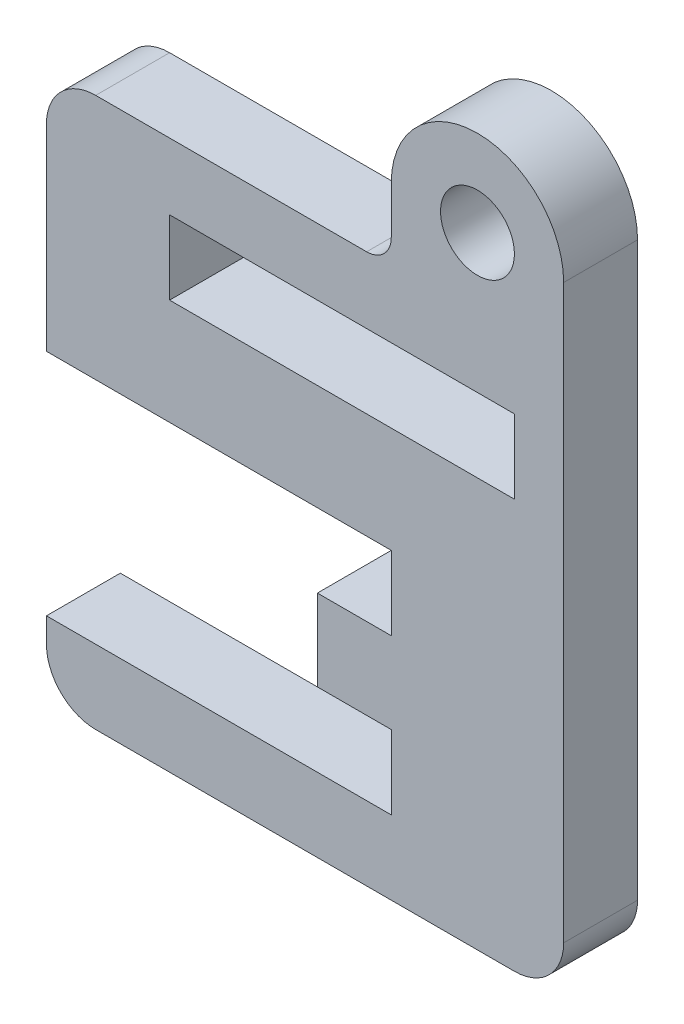
ISO-10303-21;
HEADER;
FILE_DESCRIPTION(('STEP AP214'),'2;1');
FILE_NAME('part.step','',(''),(''),'','','');
FILE_SCHEMA(('AUTOMOTIVE_DESIGN { 1 0 10303 214 1 1 1 1 }'));
ENDSEC;
DATA;
#1=APPLICATION_CONTEXT('core data for automotive mechanical design processes');
#2=APPLICATION_PROTOCOL_DEFINITION('international standard','automotive_design',2000,#1);
#3=PRODUCT_CONTEXT('',#1,'mechanical');
#4=PRODUCT('Part','Part','',(#3));
#5=PRODUCT_RELATED_PRODUCT_CATEGORY('part','',(#4));
#6=PRODUCT_DEFINITION_FORMATION('','',#4);
#7=PRODUCT_DEFINITION_CONTEXT('part definition',#1,'design');
#8=PRODUCT_DEFINITION('design','',#6,#7);
#9=PRODUCT_DEFINITION_SHAPE('','',#8);
#10=(LENGTH_UNIT() NAMED_UNIT(*) SI_UNIT(.MILLI.,.METRE.));
#11=(NAMED_UNIT(*) PLANE_ANGLE_UNIT() SI_UNIT($,.RADIAN.));
#12=(NAMED_UNIT(*) SI_UNIT($,.STERADIAN.) SOLID_ANGLE_UNIT());
#13=UNCERTAINTY_MEASURE_WITH_UNIT(LENGTH_MEASURE(1.E-05),#10,'distance_accuracy_value','');
#14=(GEOMETRIC_REPRESENTATION_CONTEXT(3) GLOBAL_UNCERTAINTY_ASSIGNED_CONTEXT((#13)) GLOBAL_UNIT_ASSIGNED_CONTEXT((#10,
#11,#12)) REPRESENTATION_CONTEXT('',''));
#15=CARTESIAN_POINT('',(0.,0.,0.));
#16=DIRECTION('',(0.,0.,1.));
#17=DIRECTION('',(1.,0.,0.));
#18=AXIS2_PLACEMENT_3D('',#15,#16,#17);
#19=CARTESIAN_POINT('',(-22.6037836217601,-2.1337939347687,3.));
#20=DIRECTION('',(1.,0.,0.));
#21=DIRECTION('',(0.,1.,0.));
#22=AXIS2_PLACEMENT_3D('',#19,#20,#21);
#23=PLANE('',#22);
#24=DIRECTION('',(0.,-1.,0.));
#25=VECTOR('',#24,1.);
#26=CARTESIAN_POINT('',(-22.6037836217601,-2.1337939347687,0.));
#27=LINE('',#26,#25);
#28=CARTESIAN_POINT('',(-22.6037836217601,16.1662060652313,0.));
#29=VERTEX_POINT('',#28);
#30=CARTESIAN_POINT('',(-22.6037836217601,8.1662060652313,0.));
#31=VERTEX_POINT('',#30);
#32=EDGE_CURVE('E273',#29,#31,#27,.T.);
#33=ORIENTED_EDGE('',*,*,#32,.T.);
#34=DIRECTION('',(0.,0.,1.));
#35=VECTOR('',#34,1.);
#36=CARTESIAN_POINT('',(-22.6037836217601,8.1662060652313,0.));
#37=LINE('',#36,#35);
#38=CARTESIAN_POINT('',(-22.6037836217601,8.1662060652313,3.));
#39=VERTEX_POINT('',#38);
#40=EDGE_CURVE('E432',#31,#39,#37,.T.);
#41=ORIENTED_EDGE('',*,*,#40,.T.);
#42=DIRECTION('',(0.,-1.,0.));
#43=VECTOR('',#42,1.);
#44=CARTESIAN_POINT('',(-22.6037836217601,-2.1337939347687,3.));
#45=LINE('',#44,#43);
#46=CARTESIAN_POINT('',(-22.6037836217601,16.1662060652313,3.));
#47=VERTEX_POINT('',#46);
#48=EDGE_CURVE('E238',#47,#39,#45,.T.);
#49=ORIENTED_EDGE('',*,*,#48,.F.);
#50=DIRECTION('',(0.,0.,-1.));
#51=VECTOR('',#50,1.);
#52=CARTESIAN_POINT('',(-22.6037836217601,16.1662060652313,3.));
#53=LINE('',#52,#51);
#54=EDGE_CURVE('E11',#47,#29,#53,.T.);
#55=ORIENTED_EDGE('',*,*,#54,.T.);
#56=EDGE_LOOP('',(#33,#41,#49,#55));
#57=FACE_BOUND('',#56,.T.);
#58=ADVANCED_FACE('F45',(#57),#23,.F.);
#59=CARTESIAN_POINT('',(-20.6037836217601,16.1662060652313,3.));
#60=DIRECTION('',(0.,0.,-1.));
#61=DIRECTION('',(-1.,0.,0.));
#62=AXIS2_PLACEMENT_3D('',#59,#60,#61);
#63=CYLINDRICAL_SURFACE('',#62,2.);
#64=CARTESIAN_POINT('',(-20.6037836217601,16.1662060652313,0.));
#65=DIRECTION('',(0.,0.,1.));
#66=DIRECTION('',(-1.,0.,0.));
#67=AXIS2_PLACEMENT_3D('',#64,#65,#66);
#68=CIRCLE('',#67,2.);
#69=CARTESIAN_POINT('',(-20.6037836217601,18.1662060652313,0.));
#70=VERTEX_POINT('',#69);
#71=EDGE_CURVE('E267',#70,#29,#68,.T.);
#72=ORIENTED_EDGE('',*,*,#71,.T.);
#73=ORIENTED_EDGE('',*,*,#54,.F.);
#74=CARTESIAN_POINT('',(-20.6037836217601,16.1662060652313,3.));
#75=DIRECTION('',(0.,0.,1.));
#76=DIRECTION('',(-1.,0.,0.));
#77=AXIS2_PLACEMENT_3D('',#74,#75,#76);
#78=CIRCLE('',#77,2.);
#79=CARTESIAN_POINT('',(-20.6037836217601,18.1662060652313,3.));
#80=VERTEX_POINT('',#79);
#81=EDGE_CURVE('E232',#80,#47,#78,.T.);
#82=ORIENTED_EDGE('',*,*,#81,.F.);
#83=DIRECTION('',(0.,0.,-1.));
#84=VECTOR('',#83,1.);
#85=CARTESIAN_POINT('',(-20.6037836217601,18.1662060652313,3.));
#86=LINE('',#85,#84);
#87=EDGE_CURVE('E266',#80,#70,#86,.T.);
#88=ORIENTED_EDGE('',*,*,#87,.T.);
#89=EDGE_LOOP('',(#72,#73,#82,#88));
#90=FACE_BOUND('',#89,.T.);
#91=ADVANCED_FACE('F47',(#90),#63,.T.);
#92=CARTESIAN_POINT('',(-22.6037836217601,-1.1337939347687,3.));
#93=VERTEX_POINT('',#92);
#94=CARTESIAN_POINT('',(-22.6037836217601,-2.1337939347687,3.));
#95=VERTEX_POINT('',#94);
#96=EDGE_CURVE('E236',#93,#95,#45,.T.);
#97=ORIENTED_EDGE('',*,*,#96,.F.);
#98=DIRECTION('',(0.,0.,1.));
#99=VECTOR('',#98,1.);
#100=CARTESIAN_POINT('',(-22.6037836217601,-1.1337939347687,0.));
#101=LINE('',#100,#99);
#102=CARTESIAN_POINT('',(-22.6037836217601,-1.1337939347687,0.));
#103=VERTEX_POINT('',#102);
#104=EDGE_CURVE('E218',#103,#93,#101,.T.);
#105=ORIENTED_EDGE('',*,*,#104,.F.);
#106=CARTESIAN_POINT('',(-22.6037836217601,-2.1337939347687,0.));
#107=VERTEX_POINT('',#106);
#108=EDGE_CURVE('E271',#103,#107,#27,.T.);
#109=ORIENTED_EDGE('',*,*,#108,.T.);
#110=DIRECTION('',(0.,0.,-1.));
#111=VECTOR('',#110,1.);
#112=CARTESIAN_POINT('',(-22.6037836217601,-2.1337939347687,3.));
#113=LINE('',#112,#111);
#114=EDGE_CURVE('E54',#95,#107,#113,.T.);
#115=ORIENTED_EDGE('',*,*,#114,.F.);
#116=EDGE_LOOP('',(#97,#105,#109,#115));
#117=FACE_BOUND('',#116,.T.);
#118=ADVANCED_FACE('F505',(#117),#23,.F.);
#119=CARTESIAN_POINT('',(-20.6037836217601,-2.1337939347687,3.));
#120=DIRECTION('',(0.,0.,-1.));
#121=DIRECTION('',(-1.,0.,0.));
#122=AXIS2_PLACEMENT_3D('',#119,#120,#121);
#123=CYLINDRICAL_SURFACE('',#122,2.);
#124=CARTESIAN_POINT('',(-20.6037836217601,-2.1337939347687,0.));
#125=DIRECTION('',(0.,0.,1.));
#126=DIRECTION('',(-1.,0.,0.));
#127=AXIS2_PLACEMENT_3D('',#124,#125,#126);
#128=CIRCLE('',#127,2.);
#129=CARTESIAN_POINT('',(-20.6037836217601,-4.1337939347687,0.));
#130=VERTEX_POINT('',#129);
#131=EDGE_CURVE('E277',#107,#130,#128,.T.);
#132=ORIENTED_EDGE('',*,*,#131,.T.);
#133=DIRECTION('',(0.,0.,-1.));
#134=VECTOR('',#133,1.);
#135=CARTESIAN_POINT('',(-20.6037836217601,-4.1337939347687,3.));
#136=LINE('',#135,#134);
#137=CARTESIAN_POINT('',(-20.6037836217601,-4.1337939347687,3.));
#138=VERTEX_POINT('',#137);
#139=EDGE_CURVE('E327',#138,#130,#136,.T.);
#140=ORIENTED_EDGE('',*,*,#139,.F.);
#141=CARTESIAN_POINT('',(-20.6037836217601,-2.1337939347687,3.));
#142=DIRECTION('',(0.,0.,1.));
#143=DIRECTION('',(-1.,0.,0.));
#144=AXIS2_PLACEMENT_3D('',#141,#142,#143);
#145=CIRCLE('',#144,2.);
#146=EDGE_CURVE('E242',#95,#138,#145,.T.);
#147=ORIENTED_EDGE('',*,*,#146,.F.);
#148=ORIENTED_EDGE('',*,*,#114,.T.);
#149=EDGE_LOOP('',(#132,#140,#147,#148));
#150=FACE_BOUND('',#149,.T.);
#151=ADVANCED_FACE('F336',(#150),#123,.T.);
#152=CARTESIAN_POINT('',(-3.60378362176012,-4.13379393476869,3.));
#153=DIRECTION('',(0.,1.,0.));
#154=DIRECTION('',(-1.,0.,0.));
#155=AXIS2_PLACEMENT_3D('',#152,#153,#154);
#156=PLANE('',#155);
#157=DIRECTION('',(1.,0.,0.));
#158=VECTOR('',#157,1.);
#159=CARTESIAN_POINT('',(-3.60378362176012,-4.13379393476869,0.));
#160=LINE('',#159,#158);
#161=CARTESIAN_POINT('',(-3.60378362176012,-4.13379393476869,0.));
#162=VERTEX_POINT('',#161);
#163=EDGE_CURVE('E280',#130,#162,#160,.T.);
#164=ORIENTED_EDGE('',*,*,#163,.T.);
#165=DIRECTION('',(0.,0.,-1.));
#166=VECTOR('',#165,1.);
#167=CARTESIAN_POINT('',(-3.60378362176012,-4.13379393476869,3.));
#168=LINE('',#167,#166);
#169=CARTESIAN_POINT('',(-3.60378362176012,-4.13379393476869,3.));
#170=VERTEX_POINT('',#169);
#171=EDGE_CURVE('E323',#170,#162,#168,.T.);
#172=ORIENTED_EDGE('',*,*,#171,.F.);
#173=DIRECTION('',(1.,0.,0.));
#174=VECTOR('',#173,1.);
#175=CARTESIAN_POINT('',(-3.60378362176012,-4.13379393476869,3.));
#176=LINE('',#175,#174);
#177=EDGE_CURVE('E245',#138,#170,#176,.T.);
#178=ORIENTED_EDGE('',*,*,#177,.F.);
#179=ORIENTED_EDGE('',*,*,#139,.T.);
#180=EDGE_LOOP('',(#164,#172,#178,#179));
#181=FACE_BOUND('',#180,.T.);
#182=ADVANCED_FACE('F346',(#181),#156,.F.);
#183=CARTESIAN_POINT('',(-3.60378362176012,-2.13379393476869,3.));
#184=DIRECTION('',(0.,0.,-1.));
#185=DIRECTION('',(-1.,0.,0.));
#186=AXIS2_PLACEMENT_3D('',#183,#184,#185);
#187=CYLINDRICAL_SURFACE('',#186,2.);
#188=CARTESIAN_POINT('',(-3.60378362176012,-2.13379393476869,0.));
#189=DIRECTION('',(0.,0.,1.));
#190=DIRECTION('',(-1.,0.,0.));
#191=AXIS2_PLACEMENT_3D('',#188,#189,#190);
#192=CIRCLE('',#191,2.);
#193=CARTESIAN_POINT('',(-1.60378362176012,-2.13379393476869,0.));
#194=VERTEX_POINT('',#193);
#195=EDGE_CURVE('E283',#162,#194,#192,.T.);
#196=ORIENTED_EDGE('',*,*,#195,.T.);
#197=DIRECTION('',(0.,0.,-1.));
#198=VECTOR('',#197,1.);
#199=CARTESIAN_POINT('',(-1.60378362176012,-2.13379393476869,3.));
#200=LINE('',#199,#198);
#201=CARTESIAN_POINT('',(-1.60378362176012,-2.13379393476869,3.));
#202=VERTEX_POINT('',#201);
#203=EDGE_CURVE('E319',#202,#194,#200,.T.);
#204=ORIENTED_EDGE('',*,*,#203,.F.);
#205=CARTESIAN_POINT('',(-3.60378362176012,-2.13379393476869,3.));
#206=DIRECTION('',(0.,0.,1.));
#207=DIRECTION('',(-1.,0.,0.));
#208=AXIS2_PLACEMENT_3D('',#205,#206,#207);
#209=CIRCLE('',#208,2.);
#210=EDGE_CURVE('E248',#170,#202,#209,.T.);
#211=ORIENTED_EDGE('',*,*,#210,.F.);
#212=ORIENTED_EDGE('',*,*,#171,.T.);
#213=EDGE_LOOP('',(#196,#204,#211,#212));
#214=FACE_BOUND('',#213,.T.);
#215=ADVANCED_FACE('F350',(#214),#187,.T.);
#216=CARTESIAN_POINT('',(-1.60378362176012,21.0862060652313,3.));
#217=DIRECTION('',(-1.,0.,0.));
#218=DIRECTION('',(0.,0.,1.));
#219=AXIS2_PLACEMENT_3D('',#216,#217,#218);
#220=PLANE('',#219);
#221=DIRECTION('',(0.,1.,0.));
#222=VECTOR('',#221,1.);
#223=CARTESIAN_POINT('',(-1.60378362176012,21.0862060652313,0.));
#224=LINE('',#223,#222);
#225=CARTESIAN_POINT('',(-1.60378362176012,21.0862060652313,0.));
#226=VERTEX_POINT('',#225);
#227=EDGE_CURVE('E286',#194,#226,#224,.T.);
#228=ORIENTED_EDGE('',*,*,#227,.T.);
#229=DIRECTION('',(0.,0.,-1.));
#230=VECTOR('',#229,1.);
#231=CARTESIAN_POINT('',(-1.60378362176012,21.0862060652313,3.));
#232=LINE('',#231,#230);
#233=CARTESIAN_POINT('',(-1.60378362176012,21.0862060652313,3.));
#234=VERTEX_POINT('',#233);
#235=EDGE_CURVE('E315',#234,#226,#232,.T.);
#236=ORIENTED_EDGE('',*,*,#235,.F.);
#237=DIRECTION('',(0.,1.,0.));
#238=VECTOR('',#237,1.);
#239=CARTESIAN_POINT('',(-1.60378362176012,21.0862060652313,3.));
#240=LINE('',#239,#238);
#241=EDGE_CURVE('E251',#202,#234,#240,.T.);
#242=ORIENTED_EDGE('',*,*,#241,.F.);
#243=ORIENTED_EDGE('',*,*,#203,.T.);
#244=EDGE_LOOP('',(#228,#236,#242,#243));
#245=FACE_BOUND('',#244,.T.);
#246=ADVANCED_FACE('F495',(#245),#220,.F.);
#247=CARTESIAN_POINT('',(-5.10378362176011,21.0862060652313,3.));
#248=DIRECTION('',(0.,0.,-1.));
#249=DIRECTION('',(-1.,0.,0.));
#250=AXIS2_PLACEMENT_3D('',#247,#248,#249);
#251=CYLINDRICAL_SURFACE('',#250,3.49999999999999);
#252=CARTESIAN_POINT('',(-5.10378362176011,21.0862060652313,0.));
#253=DIRECTION('',(0.,0.,1.));
#254=DIRECTION('',(-1.,0.,0.));
#255=AXIS2_PLACEMENT_3D('',#252,#253,#254);
#256=CIRCLE('',#255,3.49999999999999);
#257=CARTESIAN_POINT('',(-8.6037836217601,21.0862060652313,0.));
#258=VERTEX_POINT('',#257);
#259=EDGE_CURVE('E289',#226,#258,#256,.T.);
#260=ORIENTED_EDGE('',*,*,#259,.T.);
#261=DIRECTION('',(0.,0.,-1.));
#262=VECTOR('',#261,1.);
#263=CARTESIAN_POINT('',(-8.6037836217601,21.0862060652313,3.));
#264=LINE('',#263,#262);
#265=CARTESIAN_POINT('',(-8.6037836217601,21.0862060652313,3.));
#266=VERTEX_POINT('',#265);
#267=EDGE_CURVE('E311',#266,#258,#264,.T.);
#268=ORIENTED_EDGE('',*,*,#267,.F.);
#269=CARTESIAN_POINT('',(-5.10378362176011,21.0862060652313,3.));
#270=DIRECTION('',(0.,0.,1.));
#271=DIRECTION('',(-1.,0.,0.));
#272=AXIS2_PLACEMENT_3D('',#269,#270,#271);
#273=CIRCLE('',#272,3.49999999999999);
#274=EDGE_CURVE('E254',#234,#266,#273,.T.);
#275=ORIENTED_EDGE('',*,*,#274,.F.);
#276=ORIENTED_EDGE('',*,*,#235,.T.);
#277=EDGE_LOOP('',(#260,#268,#275,#276));
#278=FACE_BOUND('',#277,.T.);
#279=ADVANCED_FACE('F492',(#278),#251,.T.);
#280=CARTESIAN_POINT('',(-8.6037836217601,19.1662060652313,3.));
#281=DIRECTION('',(1.,0.,0.));
#282=DIRECTION('',(0.,0.,-1.));
#283=AXIS2_PLACEMENT_3D('',#280,#281,#282);
#284=PLANE('',#283);
#285=DIRECTION('',(0.,-1.,0.));
#286=VECTOR('',#285,1.);
#287=CARTESIAN_POINT('',(-8.6037836217601,19.1662060652313,0.));
#288=LINE('',#287,#286);
#289=CARTESIAN_POINT('',(-8.6037836217601,19.1662060652313,0.));
#290=VERTEX_POINT('',#289);
#291=EDGE_CURVE('E292',#258,#290,#288,.T.);
#292=ORIENTED_EDGE('',*,*,#291,.T.);
#293=DIRECTION('',(0.,0.,-1.));
#294=VECTOR('',#293,1.);
#295=CARTESIAN_POINT('',(-8.6037836217601,19.1662060652313,3.));
#296=LINE('',#295,#294);
#297=CARTESIAN_POINT('',(-8.6037836217601,19.1662060652313,3.));
#298=VERTEX_POINT('',#297);
#299=EDGE_CURVE('E307',#298,#290,#296,.T.);
#300=ORIENTED_EDGE('',*,*,#299,.F.);
#301=DIRECTION('',(0.,-1.,0.));
#302=VECTOR('',#301,1.);
#303=CARTESIAN_POINT('',(-8.6037836217601,19.1662060652313,3.));
#304=LINE('',#303,#302);
#305=EDGE_CURVE('E257',#266,#298,#304,.T.);
#306=ORIENTED_EDGE('',*,*,#305,.F.);
#307=ORIENTED_EDGE('',*,*,#267,.T.);
#308=EDGE_LOOP('',(#292,#300,#306,#307));
#309=FACE_BOUND('',#308,.T.);
#310=ADVANCED_FACE('F488',(#309),#284,.F.);
#311=CARTESIAN_POINT('',(-9.6037836217601,19.1662060652313,3.));
#312=DIRECTION('',(0.,0.,-1.));
#313=DIRECTION('',(-1.,0.,0.));
#314=AXIS2_PLACEMENT_3D('',#311,#312,#313);
#315=CYLINDRICAL_SURFACE('',#314,1.);
#316=CARTESIAN_POINT('',(-9.6037836217601,19.1662060652313,0.));
#317=DIRECTION('',(0.,0.,-1.));
#318=DIRECTION('',(1.,0.,0.));
#319=AXIS2_PLACEMENT_3D('',#316,#317,#318);
#320=CIRCLE('',#319,1.);
#321=CARTESIAN_POINT('',(-9.6037836217601,18.1662060652313,0.));
#322=VERTEX_POINT('',#321);
#323=EDGE_CURVE('E295',#290,#322,#320,.T.);
#324=ORIENTED_EDGE('',*,*,#323,.T.);
#325=DIRECTION('',(0.,0.,-1.));
#326=VECTOR('',#325,1.);
#327=CARTESIAN_POINT('',(-9.6037836217601,18.1662060652313,3.));
#328=LINE('',#327,#326);
#329=CARTESIAN_POINT('',(-9.6037836217601,18.1662060652313,3.));
#330=VERTEX_POINT('',#329);
#331=EDGE_CURVE('E303',#330,#322,#328,.T.);
#332=ORIENTED_EDGE('',*,*,#331,.F.);
#333=CARTESIAN_POINT('',(-9.6037836217601,19.1662060652313,3.));
#334=DIRECTION('',(0.,0.,-1.));
#335=DIRECTION('',(1.,0.,0.));
#336=AXIS2_PLACEMENT_3D('',#333,#334,#335);
#337=CIRCLE('',#336,1.);
#338=EDGE_CURVE('E260',#298,#330,#337,.T.);
#339=ORIENTED_EDGE('',*,*,#338,.F.);
#340=ORIENTED_EDGE('',*,*,#299,.T.);
#341=EDGE_LOOP('',(#324,#332,#339,#340));
#342=FACE_BOUND('',#341,.T.);
#343=ADVANCED_FACE('F484',(#342),#315,.F.);
#344=CARTESIAN_POINT('',(-20.6037836217601,18.1662060652313,3.));
#345=DIRECTION('',(0.,-1.,0.));
#346=DIRECTION('',(0.,0.,-1.));
#347=AXIS2_PLACEMENT_3D('',#344,#345,#346);
#348=PLANE('',#347);
#349=DIRECTION('',(-1.,0.,0.));
#350=VECTOR('',#349,1.);
#351=CARTESIAN_POINT('',(-20.6037836217601,18.1662060652313,0.));
#352=LINE('',#351,#350);
#353=EDGE_CURVE('E237',#322,#70,#352,.T.);
#354=ORIENTED_EDGE('',*,*,#353,.T.);
#355=ORIENTED_EDGE('',*,*,#87,.F.);
#356=DIRECTION('',(-1.,0.,0.));
#357=VECTOR('',#356,1.);
#358=CARTESIAN_POINT('',(-20.6037836217601,18.1662060652313,3.));
#359=LINE('',#358,#357);
#360=EDGE_CURVE('E263',#330,#80,#359,.T.);
#361=ORIENTED_EDGE('',*,*,#360,.F.);
#362=ORIENTED_EDGE('',*,*,#331,.T.);
#363=EDGE_LOOP('',(#354,#355,#361,#362));
#364=FACE_BOUND('',#363,.T.);
#365=ADVANCED_FACE('F479',(#364),#348,.F.);
#366=CARTESIAN_POINT('',(-20.6037836217601,16.1662060652313,3.));
#367=DIRECTION('',(0.,0.,-1.));
#368=DIRECTION('',(-1.,0.,0.));
#369=AXIS2_PLACEMENT_3D('',#366,#367,#368);
#370=PLANE('',#369);
#371=CARTESIAN_POINT('',(-5.10378362176011,21.0862060652313,3.));
#372=DIRECTION('',(0.,0.,1.));
#373=DIRECTION('',(1.,0.,0.));
#374=AXIS2_PLACEMENT_3D('',#371,#372,#373);
#375=CIRCLE('',#374,1.5);
#376=CARTESIAN_POINT('',(-3.60378362176011,21.0862060652313,3.));
#377=VERTEX_POINT('',#376);
#378=EDGE_CURVE('E449',#377,#377,#375,.T.);
#379=ORIENTED_EDGE('',*,*,#378,.F.);
#380=EDGE_LOOP('',(#379));
#381=FACE_BOUND('',#380,.T.);
#382=DIRECTION('',(1.,0.,0.));
#383=VECTOR('',#382,1.);
#384=CARTESIAN_POINT('',(-17.6037836217601,12.4662060652313,3.));
#385=LINE('',#384,#383);
#386=CARTESIAN_POINT('',(-17.6037836217601,12.4662060652313,3.));
#387=VERTEX_POINT('',#386);
#388=CARTESIAN_POINT('',(-3.60378362176012,12.4662060652313,3.));
#389=VERTEX_POINT('',#388);
#390=EDGE_CURVE('E398',#387,#389,#385,.T.);
#391=ORIENTED_EDGE('',*,*,#390,.F.);
#392=DIRECTION('',(0.,-1.,0.));
#393=VECTOR('',#392,1.);
#394=CARTESIAN_POINT('',(-17.6037836217601,15.4662060652313,3.));
#395=LINE('',#394,#393);
#396=CARTESIAN_POINT('',(-17.6037836217601,15.4662060652313,3.));
#397=VERTEX_POINT('',#396);
#398=EDGE_CURVE('E69',#397,#387,#395,.T.);
#399=ORIENTED_EDGE('',*,*,#398,.F.);
#400=DIRECTION('',(-1.,0.,0.));
#401=VECTOR('',#400,1.);
#402=CARTESIAN_POINT('',(-17.6037836217601,15.4662060652313,3.));
#403=LINE('',#402,#401);
#404=CARTESIAN_POINT('',(-3.60378362176012,15.4662060652313,3.));
#405=VERTEX_POINT('',#404);
#406=EDGE_CURVE('E390',#405,#397,#403,.T.);
#407=ORIENTED_EDGE('',*,*,#406,.F.);
#408=DIRECTION('',(0.,1.,0.));
#409=VECTOR('',#408,1.);
#410=CARTESIAN_POINT('',(-3.60378362176012,15.4662060652313,3.));
#411=LINE('',#410,#409);
#412=EDGE_CURVE('E394',#389,#405,#411,.T.);
#413=ORIENTED_EDGE('',*,*,#412,.F.);
#414=EDGE_LOOP('',(#391,#399,#407,#413));
#415=FACE_BOUND('',#414,.T.);
#416=DIRECTION('',(1.,0.,0.));
#417=VECTOR('',#416,1.);
#418=CARTESIAN_POINT('',(-22.6037836217601,5.1662060652313,3.));
#419=LINE('',#418,#417);
#420=CARTESIAN_POINT('',(-11.6037836217601,5.1662060652313,3.));
#421=VERTEX_POINT('',#420);
#422=CARTESIAN_POINT('',(-8.60378362176012,5.1662060652313,3.));
#423=VERTEX_POINT('',#422);
#424=EDGE_CURVE('E404',#421,#423,#419,.T.);
#425=ORIENTED_EDGE('',*,*,#424,.F.);
#426=DIRECTION('',(0.,1.,0.));
#427=VECTOR('',#426,1.);
#428=CARTESIAN_POINT('',(-11.6037836217601,5.1662060652313,3.));
#429=LINE('',#428,#427);
#430=CARTESIAN_POINT('',(-11.6037836217601,1.8662060652313,3.));
#431=VERTEX_POINT('',#430);
#432=EDGE_CURVE('E61',#431,#421,#429,.T.);
#433=ORIENTED_EDGE('',*,*,#432,.F.);
#434=DIRECTION('',(-1.,0.,0.));
#435=VECTOR('',#434,1.);
#436=CARTESIAN_POINT('',(-22.6037836217601,1.8662060652313,3.));
#437=LINE('',#436,#435);
#438=CARTESIAN_POINT('',(-8.60378362176012,1.8662060652313,3.));
#439=VERTEX_POINT('',#438);
#440=EDGE_CURVE('E210',#439,#431,#437,.T.);
#441=ORIENTED_EDGE('',*,*,#440,.F.);
#442=DIRECTION('',(0.,1.,0.));
#443=VECTOR('',#442,1.);
#444=CARTESIAN_POINT('',(-8.60378362176012,1.8662060652313,3.));
#445=LINE('',#444,#443);
#446=CARTESIAN_POINT('',(-8.60378362176012,-1.1337939347687,3.));
#447=VERTEX_POINT('',#446);
#448=EDGE_CURVE('E438',#447,#439,#445,.T.);
#449=ORIENTED_EDGE('',*,*,#448,.F.);
#450=DIRECTION('',(1.,0.,0.));
#451=VECTOR('',#450,1.);
#452=CARTESIAN_POINT('',(-22.6037836217601,-1.1337939347687,3.));
#453=LINE('',#452,#451);
#454=EDGE_CURVE('E227',#93,#447,#453,.T.);
#455=ORIENTED_EDGE('',*,*,#454,.F.);
#456=ORIENTED_EDGE('',*,*,#96,.T.);
#457=ORIENTED_EDGE('',*,*,#146,.T.);
#458=ORIENTED_EDGE('',*,*,#177,.T.);
#459=ORIENTED_EDGE('',*,*,#210,.T.);
#460=ORIENTED_EDGE('',*,*,#241,.T.);
#461=ORIENTED_EDGE('',*,*,#274,.T.);
#462=ORIENTED_EDGE('',*,*,#305,.T.);
#463=ORIENTED_EDGE('',*,*,#338,.T.);
#464=ORIENTED_EDGE('',*,*,#360,.T.);
#465=ORIENTED_EDGE('',*,*,#81,.T.);
#466=ORIENTED_EDGE('',*,*,#48,.T.);
#467=DIRECTION('',(-1.,0.,0.));
#468=VECTOR('',#467,1.);
#469=CARTESIAN_POINT('',(-22.6037836217601,8.1662060652313,3.));
#470=LINE('',#469,#468);
#471=CARTESIAN_POINT('',(-8.60378362176012,8.1662060652313,3.));
#472=VERTEX_POINT('',#471);
#473=EDGE_CURVE('E411',#472,#39,#470,.T.);
#474=ORIENTED_EDGE('',*,*,#473,.F.);
#475=DIRECTION('',(0.,1.,0.));
#476=VECTOR('',#475,1.);
#477=CARTESIAN_POINT('',(-8.60378362176012,8.1662060652313,3.));
#478=LINE('',#477,#476);
#479=EDGE_CURVE('E407',#423,#472,#478,.T.);
#480=ORIENTED_EDGE('',*,*,#479,.F.);
#481=EDGE_LOOP('',(#425,#433,#441,#449,#455,#456,#457,#458,#459,#460,#461,#462,#463,#464,#465,
#466,#474,#480));
#482=FACE_BOUND('',#481,.T.);
#483=ADVANCED_FACE('F355',(#381,#415,#482),#370,.F.);
#484=CARTESIAN_POINT('',(-20.6037836217601,16.1662060652313,0.));
#485=DIRECTION('',(0.,0.,-1.));
#486=DIRECTION('',(-1.,0.,0.));
#487=AXIS2_PLACEMENT_3D('',#484,#485,#486);
#488=PLANE('',#487);
#489=DIRECTION('',(0.,1.,0.));
#490=VECTOR('',#489,1.);
#491=CARTESIAN_POINT('',(-11.6037836217601,5.1662060652313,0.));
#492=LINE('',#491,#490);
#493=CARTESIAN_POINT('',(-11.6037836217601,1.8662060652313,0.));
#494=VERTEX_POINT('',#493);
#495=CARTESIAN_POINT('',(-11.6037836217601,5.1662060652313,0.));
#496=VERTEX_POINT('',#495);
#497=EDGE_CURVE('E193',#494,#496,#492,.T.);
#498=ORIENTED_EDGE('',*,*,#497,.T.);
#499=DIRECTION('',(1.,0.,0.));
#500=VECTOR('',#499,1.);
#501=CARTESIAN_POINT('',(-22.6037836217601,5.1662060652313,0.));
#502=LINE('',#501,#500);
#503=CARTESIAN_POINT('',(-8.60378362176012,5.1662060652313,0.));
#504=VERTEX_POINT('',#503);
#505=EDGE_CURVE('E414',#496,#504,#502,.T.);
#506=ORIENTED_EDGE('',*,*,#505,.T.);
#507=DIRECTION('',(0.,1.,0.));
#508=VECTOR('',#507,1.);
#509=CARTESIAN_POINT('',(-8.60378362176012,8.1662060652313,0.));
#510=LINE('',#509,#508);
#511=CARTESIAN_POINT('',(-8.60378362176012,8.1662060652313,0.));
#512=VERTEX_POINT('',#511);
#513=EDGE_CURVE('E417',#504,#512,#510,.T.);
#514=ORIENTED_EDGE('',*,*,#513,.T.);
#515=DIRECTION('',(-1.,0.,0.));
#516=VECTOR('',#515,1.);
#517=CARTESIAN_POINT('',(-22.6037836217601,8.1662060652313,0.));
#518=LINE('',#517,#516);
#519=EDGE_CURVE('E421',#512,#31,#518,.T.);
#520=ORIENTED_EDGE('',*,*,#519,.T.);
#521=ORIENTED_EDGE('',*,*,#32,.F.);
#522=ORIENTED_EDGE('',*,*,#71,.F.);
#523=ORIENTED_EDGE('',*,*,#353,.F.);
#524=ORIENTED_EDGE('',*,*,#323,.F.);
#525=ORIENTED_EDGE('',*,*,#291,.F.);
#526=ORIENTED_EDGE('',*,*,#259,.F.);
#527=ORIENTED_EDGE('',*,*,#227,.F.);
#528=ORIENTED_EDGE('',*,*,#195,.F.);
#529=ORIENTED_EDGE('',*,*,#163,.F.);
#530=ORIENTED_EDGE('',*,*,#131,.F.);
#531=ORIENTED_EDGE('',*,*,#108,.F.);
#532=DIRECTION('',(1.,0.,0.));
#533=VECTOR('',#532,1.);
#534=CARTESIAN_POINT('',(-22.6037836217601,-1.1337939347687,0.));
#535=LINE('',#534,#533);
#536=CARTESIAN_POINT('',(-8.60378362176012,-1.1337939347687,0.));
#537=VERTEX_POINT('',#536);
#538=EDGE_CURVE('E222',#103,#537,#535,.T.);
#539=ORIENTED_EDGE('',*,*,#538,.T.);
#540=DIRECTION('',(0.,1.,0.));
#541=VECTOR('',#540,1.);
#542=CARTESIAN_POINT('',(-8.60378362176012,1.8662060652313,0.));
#543=LINE('',#542,#541);
#544=CARTESIAN_POINT('',(-8.60378362176012,1.8662060652313,0.));
#545=VERTEX_POINT('',#544);
#546=EDGE_CURVE('E216',#537,#545,#543,.T.);
#547=ORIENTED_EDGE('',*,*,#546,.T.);
#548=DIRECTION('',(-1.,0.,0.));
#549=VECTOR('',#548,1.);
#550=CARTESIAN_POINT('',(-22.6037836217601,1.8662060652313,0.));
#551=LINE('',#550,#549);
#552=EDGE_CURVE('E207',#545,#494,#551,.T.);
#553=ORIENTED_EDGE('',*,*,#552,.T.);
#554=EDGE_LOOP('',(#498,#506,#514,#520,#521,#522,#523,#524,#525,#526,#527,#528,#529,#530,#531,
#539,#547,#553));
#555=FACE_BOUND('',#554,.T.);
#556=CARTESIAN_POINT('',(-5.10378362176011,21.0862060652313,0.));
#557=DIRECTION('',(0.,0.,1.));
#558=DIRECTION('',(1.,0.,0.));
#559=AXIS2_PLACEMENT_3D('',#556,#557,#558);
#560=CIRCLE('',#559,1.5);
#561=CARTESIAN_POINT('',(-3.60378362176011,21.0862060652313,0.));
#562=VERTEX_POINT('',#561);
#563=EDGE_CURVE('E446',#562,#562,#560,.T.);
#564=ORIENTED_EDGE('',*,*,#563,.T.);
#565=EDGE_LOOP('',(#564));
#566=FACE_BOUND('',#565,.T.);
#567=DIRECTION('',(0.,-1.,0.));
#568=VECTOR('',#567,1.);
#569=CARTESIAN_POINT('',(-17.6037836217601,15.4662060652313,0.));
#570=LINE('',#569,#568);
#571=CARTESIAN_POINT('',(-17.6037836217601,15.4662060652313,0.));
#572=VERTEX_POINT('',#571);
#573=CARTESIAN_POINT('',(-17.6037836217601,12.4662060652313,0.));
#574=VERTEX_POINT('',#573);
#575=EDGE_CURVE('E386',#572,#574,#570,.T.);
#576=ORIENTED_EDGE('',*,*,#575,.T.);
#577=DIRECTION('',(1.,0.,0.));
#578=VECTOR('',#577,1.);
#579=CARTESIAN_POINT('',(-17.6037836217601,12.4662060652313,0.));
#580=LINE('',#579,#578);
#581=CARTESIAN_POINT('',(-3.60378362176012,12.4662060652313,0.));
#582=VERTEX_POINT('',#581);
#583=EDGE_CURVE('E382',#574,#582,#580,.T.);
#584=ORIENTED_EDGE('',*,*,#583,.T.);
#585=DIRECTION('',(0.,1.,0.));
#586=VECTOR('',#585,1.);
#587=CARTESIAN_POINT('',(-3.60378362176012,15.4662060652313,0.));
#588=LINE('',#587,#586);
#589=CARTESIAN_POINT('',(-3.60378362176012,15.4662060652313,0.));
#590=VERTEX_POINT('',#589);
#591=EDGE_CURVE('E378',#582,#590,#588,.T.);
#592=ORIENTED_EDGE('',*,*,#591,.T.);
#593=DIRECTION('',(-1.,0.,0.));
#594=VECTOR('',#593,1.);
#595=CARTESIAN_POINT('',(-17.6037836217601,15.4662060652313,0.));
#596=LINE('',#595,#594);
#597=EDGE_CURVE('E374',#590,#572,#596,.T.);
#598=ORIENTED_EDGE('',*,*,#597,.T.);
#599=EDGE_LOOP('',(#576,#584,#592,#598));
#600=FACE_BOUND('',#599,.T.);
#601=ADVANCED_FACE('F213',(#555,#566,#600),#488,.T.);
#602=CARTESIAN_POINT('',(-22.6037836217601,1.8662060652313,0.));
#603=DIRECTION('',(0.,1.,0.));
#604=DIRECTION('',(-1.,0.,0.));
#605=AXIS2_PLACEMENT_3D('',#602,#603,#604);
#606=PLANE('',#605);
#607=ORIENTED_EDGE('',*,*,#440,.T.);
#608=DIRECTION('',(0.,0.,1.));
#609=VECTOR('',#608,1.);
#610=CARTESIAN_POINT('',(-11.6037836217601,1.8662060652313,0.));
#611=LINE('',#610,#609);
#612=EDGE_CURVE('E196',#494,#431,#611,.T.);
#613=ORIENTED_EDGE('',*,*,#612,.F.);
#614=ORIENTED_EDGE('',*,*,#552,.F.);
#615=DIRECTION('',(0.,0.,1.));
#616=VECTOR('',#615,1.);
#617=CARTESIAN_POINT('',(-8.60378362176012,1.8662060652313,0.));
#618=LINE('',#617,#616);
#619=EDGE_CURVE('E443',#545,#439,#618,.T.);
#620=ORIENTED_EDGE('',*,*,#619,.T.);
#621=EDGE_LOOP('',(#607,#613,#614,#620));
#622=FACE_BOUND('',#621,.T.);
#623=ADVANCED_FACE('F206',(#622),#606,.F.);
#624=CARTESIAN_POINT('',(-8.60378362176012,1.8662060652313,0.));
#625=DIRECTION('',(1.,0.,0.));
#626=DIRECTION('',(0.,0.,-1.));
#627=AXIS2_PLACEMENT_3D('',#624,#625,#626);
#628=PLANE('',#627);
#629=ORIENTED_EDGE('',*,*,#448,.T.);
#630=ORIENTED_EDGE('',*,*,#619,.F.);
#631=ORIENTED_EDGE('',*,*,#546,.F.);
#632=DIRECTION('',(0.,0.,1.));
#633=VECTOR('',#632,1.);
#634=CARTESIAN_POINT('',(-8.60378362176012,-1.1337939347687,0.));
#635=LINE('',#634,#633);
#636=EDGE_CURVE('E224',#537,#447,#635,.T.);
#637=ORIENTED_EDGE('',*,*,#636,.T.);
#638=EDGE_LOOP('',(#629,#630,#631,#637));
#639=FACE_BOUND('',#638,.T.);
#640=ADVANCED_FACE('F592',(#639),#628,.F.);
#641=CARTESIAN_POINT('',(-22.6037836217601,-1.1337939347687,0.));
#642=DIRECTION('',(0.,-1.,0.));
#643=DIRECTION('',(1.,0.,0.));
#644=AXIS2_PLACEMENT_3D('',#641,#642,#643);
#645=PLANE('',#644);
#646=ORIENTED_EDGE('',*,*,#454,.T.);
#647=ORIENTED_EDGE('',*,*,#636,.F.);
#648=ORIENTED_EDGE('',*,*,#538,.F.);
#649=ORIENTED_EDGE('',*,*,#104,.T.);
#650=EDGE_LOOP('',(#646,#647,#648,#649));
#651=FACE_BOUND('',#650,.T.);
#652=ADVANCED_FACE('F601',(#651),#645,.F.);
#653=CARTESIAN_POINT('',(-22.6037836217601,8.1662060652313,0.));
#654=DIRECTION('',(0.,1.,0.));
#655=DIRECTION('',(-1.,0.,0.));
#656=AXIS2_PLACEMENT_3D('',#653,#654,#655);
#657=PLANE('',#656);
#658=ORIENTED_EDGE('',*,*,#473,.T.);
#659=ORIENTED_EDGE('',*,*,#40,.F.);
#660=ORIENTED_EDGE('',*,*,#519,.F.);
#661=DIRECTION('',(0.,0.,1.));
#662=VECTOR('',#661,1.);
#663=CARTESIAN_POINT('',(-8.60378362176012,8.1662060652313,0.));
#664=LINE('',#663,#662);
#665=EDGE_CURVE('E429',#512,#472,#664,.T.);
#666=ORIENTED_EDGE('',*,*,#665,.T.);
#667=EDGE_LOOP('',(#658,#659,#660,#666));
#668=FACE_BOUND('',#667,.T.);
#669=ADVANCED_FACE('F611',(#668),#657,.F.);
#670=CARTESIAN_POINT('',(-8.60378362176012,8.1662060652313,0.));
#671=DIRECTION('',(1.,0.,0.));
#672=DIRECTION('',(0.,1.,0.));
#673=AXIS2_PLACEMENT_3D('',#670,#671,#672);
#674=PLANE('',#673);
#675=ORIENTED_EDGE('',*,*,#479,.T.);
#676=ORIENTED_EDGE('',*,*,#665,.F.);
#677=ORIENTED_EDGE('',*,*,#513,.F.);
#678=DIRECTION('',(0.,0.,1.));
#679=VECTOR('',#678,1.);
#680=CARTESIAN_POINT('',(-8.60378362176012,5.1662060652313,0.));
#681=LINE('',#680,#679);
#682=EDGE_CURVE('E425',#504,#423,#681,.T.);
#683=ORIENTED_EDGE('',*,*,#682,.T.);
#684=EDGE_LOOP('',(#675,#676,#677,#683));
#685=FACE_BOUND('',#684,.T.);
#686=ADVANCED_FACE('F465',(#685),#674,.F.);
#687=CARTESIAN_POINT('',(-22.6037836217601,5.1662060652313,0.));
#688=DIRECTION('',(0.,-1.,0.));
#689=DIRECTION('',(1.,0.,0.));
#690=AXIS2_PLACEMENT_3D('',#687,#688,#689);
#691=PLANE('',#690);
#692=ORIENTED_EDGE('',*,*,#505,.F.);
#693=DIRECTION('',(0.,0.,1.));
#694=VECTOR('',#693,1.);
#695=CARTESIAN_POINT('',(-11.6037836217601,5.1662060652313,0.));
#696=LINE('',#695,#694);
#697=EDGE_CURVE('E197',#496,#421,#696,.T.);
#698=ORIENTED_EDGE('',*,*,#697,.T.);
#699=ORIENTED_EDGE('',*,*,#424,.T.);
#700=ORIENTED_EDGE('',*,*,#682,.F.);
#701=EDGE_LOOP('',(#692,#698,#699,#700));
#702=FACE_BOUND('',#701,.T.);
#703=ADVANCED_FACE('F460',(#702),#691,.F.);
#704=CARTESIAN_POINT('',(-17.6037836217601,15.4662060652313,0.));
#705=DIRECTION('',(-1.,0.,0.));
#706=DIRECTION('',(0.,0.,1.));
#707=AXIS2_PLACEMENT_3D('',#704,#705,#706);
#708=PLANE('',#707);
#709=ORIENTED_EDGE('',*,*,#398,.T.);
#710=DIRECTION('',(0.,0.,1.));
#711=VECTOR('',#710,1.);
#712=CARTESIAN_POINT('',(-17.6037836217601,12.4662060652313,0.));
#713=LINE('',#712,#711);
#714=EDGE_CURVE('E371',#574,#387,#713,.T.);
#715=ORIENTED_EDGE('',*,*,#714,.F.);
#716=ORIENTED_EDGE('',*,*,#575,.F.);
#717=DIRECTION('',(0.,0.,1.));
#718=VECTOR('',#717,1.);
#719=CARTESIAN_POINT('',(-17.6037836217601,15.4662060652313,0.));
#720=LINE('',#719,#718);
#721=EDGE_CURVE('E272',#572,#397,#720,.T.);
#722=ORIENTED_EDGE('',*,*,#721,.T.);
#723=EDGE_LOOP('',(#709,#715,#716,#722));
#724=FACE_BOUND('',#723,.T.);
#725=ADVANCED_FACE('F637',(#724),#708,.F.);
#726=CARTESIAN_POINT('',(-17.6037836217601,15.4662060652313,0.));
#727=DIRECTION('',(0.,1.,0.));
#728=DIRECTION('',(-1.,0.,0.));
#729=AXIS2_PLACEMENT_3D('',#726,#727,#728);
#730=PLANE('',#729);
#731=ORIENTED_EDGE('',*,*,#406,.T.);
#732=ORIENTED_EDGE('',*,*,#721,.F.);
#733=ORIENTED_EDGE('',*,*,#597,.F.);
#734=DIRECTION('',(0.,0.,1.));
#735=VECTOR('',#734,1.);
#736=CARTESIAN_POINT('',(-3.60378362176012,15.4662060652313,0.));
#737=LINE('',#736,#735);
#738=EDGE_CURVE('E365',#590,#405,#737,.T.);
#739=ORIENTED_EDGE('',*,*,#738,.T.);
#740=EDGE_LOOP('',(#731,#732,#733,#739));
#741=FACE_BOUND('',#740,.T.);
#742=ADVANCED_FACE('F646',(#741),#730,.F.);
#743=CARTESIAN_POINT('',(-3.60378362176012,15.4662060652313,0.));
#744=DIRECTION('',(1.,0.,0.));
#745=DIRECTION('',(0.,0.,-1.));
#746=AXIS2_PLACEMENT_3D('',#743,#744,#745);
#747=PLANE('',#746);
#748=ORIENTED_EDGE('',*,*,#412,.T.);
#749=ORIENTED_EDGE('',*,*,#738,.F.);
#750=ORIENTED_EDGE('',*,*,#591,.F.);
#751=DIRECTION('',(0.,0.,1.));
#752=VECTOR('',#751,1.);
#753=CARTESIAN_POINT('',(-3.60378362176012,12.4662060652313,0.));
#754=LINE('',#753,#752);
#755=EDGE_CURVE('E368',#582,#389,#754,.T.);
#756=ORIENTED_EDGE('',*,*,#755,.T.);
#757=EDGE_LOOP('',(#748,#749,#750,#756));
#758=FACE_BOUND('',#757,.T.);
#759=ADVANCED_FACE('F655',(#758),#747,.F.);
#760=CARTESIAN_POINT('',(-17.6037836217601,12.4662060652313,0.));
#761=DIRECTION('',(0.,-1.,0.));
#762=DIRECTION('',(0.,0.,-1.));
#763=AXIS2_PLACEMENT_3D('',#760,#761,#762);
#764=PLANE('',#763);
#765=ORIENTED_EDGE('',*,*,#390,.T.);
#766=ORIENTED_EDGE('',*,*,#755,.F.);
#767=ORIENTED_EDGE('',*,*,#583,.F.);
#768=ORIENTED_EDGE('',*,*,#714,.T.);
#769=EDGE_LOOP('',(#765,#766,#767,#768));
#770=FACE_BOUND('',#769,.T.);
#771=ADVANCED_FACE('F665',(#770),#764,.F.);
#772=CARTESIAN_POINT('',(-5.10378362176011,21.0862060652313,0.));
#773=DIRECTION('',(0.,0.,1.));
#774=DIRECTION('',(1.,0.,0.));
#775=AXIS2_PLACEMENT_3D('',#772,#773,#774);
#776=CYLINDRICAL_SURFACE('',#775,1.5);
#777=ORIENTED_EDGE('',*,*,#563,.F.);
#778=EDGE_LOOP('',(#777));
#779=FACE_BOUND('',#778,.T.);
#780=ORIENTED_EDGE('',*,*,#378,.T.);
#781=EDGE_LOOP('',(#780));
#782=FACE_BOUND('',#781,.T.);
#783=ADVANCED_FACE('F675',(#779,#782),#776,.F.);
#784=CARTESIAN_POINT('',(-11.6037836217601,5.1662060652313,0.));
#785=DIRECTION('',(1.,0.,0.));
#786=DIRECTION('',(0.,0.,-1.));
#787=AXIS2_PLACEMENT_3D('',#784,#785,#786);
#788=PLANE('',#787);
#789=ORIENTED_EDGE('',*,*,#432,.T.);
#790=ORIENTED_EDGE('',*,*,#697,.F.);
#791=ORIENTED_EDGE('',*,*,#497,.F.);
#792=ORIENTED_EDGE('',*,*,#612,.T.);
#793=EDGE_LOOP('',(#789,#790,#791,#792));
#794=FACE_BOUND('',#793,.T.);
#795=ADVANCED_FACE('F195',(#794),#788,.F.);
#796=CLOSED_SHELL('',(#58,#91,#118,#151,#182,#215,#246,#279,#310,#343,#365,#483,#601,#623,#640,
#652,#669,#686,#703,#725,#742,#759,#771,#783,#795));
#797=MANIFOLD_SOLID_BREP('B2',#796);
#798=ADVANCED_BREP_SHAPE_REPRESENTATION('',(#18,#797),#14);
#799=SHAPE_DEFINITION_REPRESENTATION(#9,#798);
ENDSEC;
END-ISO-10303-21;
